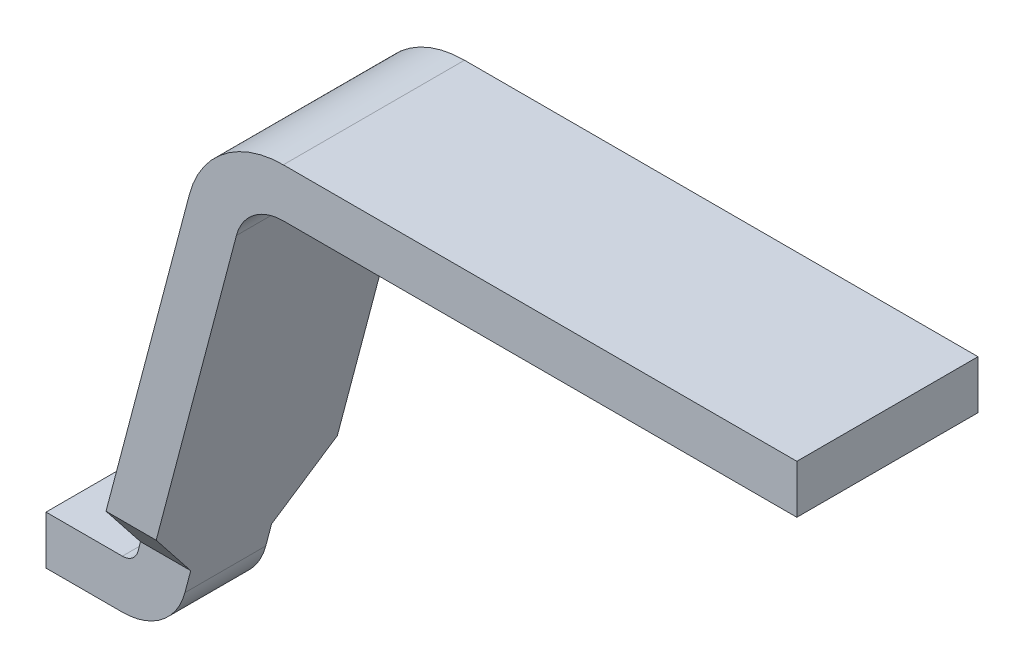
ISO-10303-21;
HEADER;
FILE_DESCRIPTION(('STEP AP214'),'2;1');
FILE_NAME('part.step','',(''),(''),'','','');
FILE_SCHEMA(('AUTOMOTIVE_DESIGN { 1 0 10303 214 1 1 1 1 }'));
ENDSEC;
DATA;
#1=APPLICATION_CONTEXT('core data for automotive mechanical design processes');
#2=APPLICATION_PROTOCOL_DEFINITION('international standard','automotive_design',2000,#1);
#3=PRODUCT_CONTEXT('',#1,'mechanical');
#4=PRODUCT('Part','Part','',(#3));
#5=PRODUCT_RELATED_PRODUCT_CATEGORY('part','',(#4));
#6=PRODUCT_DEFINITION_FORMATION('','',#4);
#7=PRODUCT_DEFINITION_CONTEXT('part definition',#1,'design');
#8=PRODUCT_DEFINITION('design','',#6,#7);
#9=PRODUCT_DEFINITION_SHAPE('','',#8);
#10=(LENGTH_UNIT() NAMED_UNIT(*) SI_UNIT(.MILLI.,.METRE.));
#11=(NAMED_UNIT(*) PLANE_ANGLE_UNIT() SI_UNIT($,.RADIAN.));
#12=(NAMED_UNIT(*) SI_UNIT($,.STERADIAN.) SOLID_ANGLE_UNIT());
#13=UNCERTAINTY_MEASURE_WITH_UNIT(LENGTH_MEASURE(1.E-05),#10,'distance_accuracy_value','');
#14=(GEOMETRIC_REPRESENTATION_CONTEXT(3) GLOBAL_UNCERTAINTY_ASSIGNED_CONTEXT((#13)) GLOBAL_UNIT_ASSIGNED_CONTEXT((#10,
#11,#12)) REPRESENTATION_CONTEXT('',''));
#15=CARTESIAN_POINT('',(0.,0.,0.));
#16=DIRECTION('',(0.,0.,1.));
#17=DIRECTION('',(1.,0.,0.));
#18=AXIS2_PLACEMENT_3D('',#15,#16,#17);
#19=CARTESIAN_POINT('',(-4.47992785115073,-3.05295006080988,1.12));
#20=DIRECTION('',(0.,1.,0.));
#21=DIRECTION('',(0.,0.,1.));
#22=AXIS2_PLACEMENT_3D('',#19,#20,#21);
#23=PLANE('',#22);
#24=DIRECTION('',(1.,0.,0.));
#25=VECTOR('',#24,1.);
#26=CARTESIAN_POINT('',(-4.95201474498883,-3.05295006080988,0.81));
#27=LINE('',#26,#25);
#28=CARTESIAN_POINT('',(-4.4799255523392,-3.05295006081318,0.81));
#29=VERTEX_POINT('',#28);
#30=CARTESIAN_POINT('',(-4.95201474498883,-3.05295006080988,0.81));
#31=VERTEX_POINT('',#30);
#32=EDGE_CURVE('E176',#29,#31,#27,.F.);
#33=ORIENTED_EDGE('',*,*,#32,.T.);
#34=DIRECTION('',(0.,0.,-1.));
#35=VECTOR('',#34,1.);
#36=CARTESIAN_POINT('',(-4.95201474498883,-3.05295006080988,1.12));
#37=LINE('',#36,#35);
#38=CARTESIAN_POINT('',(-4.95201474498883,-3.05295006080988,0.31));
#39=VERTEX_POINT('',#38);
#40=EDGE_CURVE('E169',#31,#39,#37,.T.);
#41=ORIENTED_EDGE('',*,*,#40,.T.);
#42=DIRECTION('',(1.,0.,0.));
#43=VECTOR('',#42,1.);
#44=CARTESIAN_POINT('',(-4.95201474498883,-3.05295006080988,0.31));
#45=LINE('',#44,#43);
#46=CARTESIAN_POINT('',(-4.4799255523392,-3.05295006081318,0.31));
#47=VERTEX_POINT('',#46);
#48=EDGE_CURVE('E185',#39,#47,#45,.T.);
#49=ORIENTED_EDGE('',*,*,#48,.T.);
#50=DIRECTION('',(0.,0.,-1.));
#51=VECTOR('',#50,1.);
#52=CARTESIAN_POINT('',(-4.4799255523392,-3.05295006081649,1.12));
#53=LINE('',#52,#51);
#54=EDGE_CURVE('E182',#29,#47,#53,.T.);
#55=ORIENTED_EDGE('',*,*,#54,.F.);
#56=EDGE_LOOP('',(#33,#41,#49,#55));
#57=FACE_BOUND('',#56,.T.);
#58=ADVANCED_FACE('F18',(#57),#23,.F.);
#59=CARTESIAN_POINT('',(-4.95201474498883,-2.75295117219364,1.12));
#60=DIRECTION('',(1.,0.,0.));
#61=DIRECTION('',(0.,0.,-1.));
#62=AXIS2_PLACEMENT_3D('',#59,#60,#61);
#63=PLANE('',#62);
#64=DIRECTION('',(0.,1.,0.));
#65=VECTOR('',#64,1.);
#66=CARTESIAN_POINT('',(-4.95201474498883,-2.61932913149392,0.81));
#67=LINE('',#66,#65);
#68=CARTESIAN_POINT('',(-4.95201474498883,-2.75295117219364,0.81));
#69=VERTEX_POINT('',#68);
#70=EDGE_CURVE('E172',#31,#69,#67,.T.);
#71=ORIENTED_EDGE('',*,*,#70,.T.);
#72=DIRECTION('',(0.,0.,1.));
#73=VECTOR('',#72,1.);
#74=CARTESIAN_POINT('',(-4.95201474498883,-2.75295117219364,1.12));
#75=LINE('',#74,#73);
#76=CARTESIAN_POINT('',(-4.95201474498883,-2.75295117219365,0.31));
#77=VERTEX_POINT('',#76);
#78=EDGE_CURVE('E167',#69,#77,#75,.F.);
#79=ORIENTED_EDGE('',*,*,#78,.T.);
#80=DIRECTION('',(0.,-1.,0.));
#81=VECTOR('',#80,1.);
#82=CARTESIAN_POINT('',(-4.95201474498883,-2.61932913149392,0.31));
#83=LINE('',#82,#81);
#84=EDGE_CURVE('E186',#77,#39,#83,.T.);
#85=ORIENTED_EDGE('',*,*,#84,.T.);
#86=ORIENTED_EDGE('',*,*,#40,.F.);
#87=EDGE_LOOP('',(#71,#79,#85,#86));
#88=FACE_BOUND('',#87,.T.);
#89=ADVANCED_FACE('F292',(#88),#63,.F.);
#90=CARTESIAN_POINT('',(-4.4799255523392,-2.75295117219365,1.12));
#91=DIRECTION('',(0.,-1.,0.));
#92=DIRECTION('',(1.,0.,0.));
#93=AXIS2_PLACEMENT_3D('',#90,#91,#92);
#94=PLANE('',#93);
#95=DIRECTION('',(1.,0.,0.));
#96=VECTOR('',#95,1.);
#97=CARTESIAN_POINT('',(-4.95201474498883,-2.75295117219364,0.81));
#98=LINE('',#97,#96);
#99=CARTESIAN_POINT('',(-4.4799255523392,-2.75295117219364,0.81));
#100=VERTEX_POINT('',#99);
#101=EDGE_CURVE('E175',#69,#100,#98,.T.);
#102=ORIENTED_EDGE('',*,*,#101,.T.);
#103=DIRECTION('',(0.,0.,-1.));
#104=VECTOR('',#103,1.);
#105=CARTESIAN_POINT('',(-4.4799255523392,-2.75295117219364,1.12));
#106=LINE('',#105,#104);
#107=CARTESIAN_POINT('',(-4.4799255523392,-2.75295117219365,0.31));
#108=VERTEX_POINT('',#107);
#109=EDGE_CURVE('E138',#100,#108,#106,.T.);
#110=ORIENTED_EDGE('',*,*,#109,.T.);
#111=DIRECTION('',(1.,0.,0.));
#112=VECTOR('',#111,1.);
#113=CARTESIAN_POINT('',(-4.95201474498883,-2.75295117219365,0.31));
#114=LINE('',#113,#112);
#115=EDGE_CURVE('E135',#108,#77,#114,.F.);
#116=ORIENTED_EDGE('',*,*,#115,.T.);
#117=ORIENTED_EDGE('',*,*,#78,.F.);
#118=EDGE_LOOP('',(#102,#110,#116,#117));
#119=FACE_BOUND('',#118,.T.);
#120=ADVANCED_FACE('F294',(#119),#94,.F.);
#121=CARTESIAN_POINT('',(-4.4799255523392,-2.65295117219366,1.12));
#122=DIRECTION('',(0.,0.,-1.));
#123=DIRECTION('',(-1.,0.,0.));
#124=AXIS2_PLACEMENT_3D('',#121,#122,#123);
#125=CYLINDRICAL_SURFACE('',#124,0.0999999999999786);
#126=CARTESIAN_POINT('',(-4.4799255523392,-2.65295117219366,0.81));
#127=DIRECTION('',(0.,0.,-1.));
#128=DIRECTION('',(-1.,0.,0.));
#129=AXIS2_PLACEMENT_3D('',#126,#127,#128);
#130=CIRCLE('',#129,0.0999999999999786);
#131=CARTESIAN_POINT('',(-4.38323405398539,-2.67846105549578,0.81));
#132=VERTEX_POINT('',#131);
#133=EDGE_CURVE('E151',#100,#132,#130,.F.);
#134=ORIENTED_EDGE('',*,*,#133,.T.);
#135=DIRECTION('',(0.,0.,1.));
#136=VECTOR('',#135,1.);
#137=CARTESIAN_POINT('',(-4.38323405398538,-2.67846105549574,1.12));
#138=LINE('',#137,#136);
#139=CARTESIAN_POINT('',(-4.38323405398539,-2.67846105549578,0.31));
#140=VERTEX_POINT('',#139);
#141=EDGE_CURVE('E143',#132,#140,#138,.F.);
#142=ORIENTED_EDGE('',*,*,#141,.T.);
#143=CARTESIAN_POINT('',(-4.4799255523392,-2.65295117219366,0.31));
#144=DIRECTION('',(0.,0.,-1.));
#145=DIRECTION('',(-1.,0.,0.));
#146=AXIS2_PLACEMENT_3D('',#143,#144,#145);
#147=CIRCLE('',#146,0.0999999999999786);
#148=EDGE_CURVE('E21',#140,#108,#147,.T.);
#149=ORIENTED_EDGE('',*,*,#148,.T.);
#150=ORIENTED_EDGE('',*,*,#109,.F.);
#151=EDGE_LOOP('',(#134,#142,#149,#150));
#152=FACE_BOUND('',#151,.T.);
#153=ADVANCED_FACE('F149',(#152),#125,.F.);
#154=CARTESIAN_POINT('',(-4.95201474498883,-2.61932913149392,0.31));
#155=DIRECTION('',(0.,0.,1.));
#156=DIRECTION('',(0.,-1.,0.));
#157=AXIS2_PLACEMENT_3D('',#154,#155,#156);
#158=PLANE('',#157);
#159=DIRECTION('',(-0.255098833021712,-0.966914983538346,0.));
#160=VECTOR('',#159,1.);
#161=CARTESIAN_POINT('',(-3.46485004867951,-0.373470633608013,0.309999999999999));
#162=LINE('',#161,#160);
#163=CARTESIAN_POINT('',(-4.05736944458963,-2.61932913149392,0.31));
#164=VERTEX_POINT('',#163);
#165=CARTESIAN_POINT('',(-4.09316070833002,-2.75499070540402,0.31));
#166=VERTEX_POINT('',#165);
#167=EDGE_CURVE('E223',#164,#166,#162,.T.);
#168=ORIENTED_EDGE('',*,*,#167,.T.);
#169=CARTESIAN_POINT('',(-4.4799255523392,-2.65295117219366,0.31));
#170=DIRECTION('',(0.,0.,-1.));
#171=DIRECTION('',(-1.,0.,0.));
#172=AXIS2_PLACEMENT_3D('',#169,#170,#171);
#173=CIRCLE('',#172,0.399998888622822);
#174=EDGE_CURVE('E184',#47,#166,#173,.F.);
#175=ORIENTED_EDGE('',*,*,#174,.F.);
#176=ORIENTED_EDGE('',*,*,#48,.F.);
#177=ORIENTED_EDGE('',*,*,#84,.F.);
#178=ORIENTED_EDGE('',*,*,#115,.F.);
#179=ORIENTED_EDGE('',*,*,#148,.F.);
#180=DIRECTION('',(0.255098833021717,0.966914983538345,0.));
#181=VECTOR('',#180,1.);
#182=CARTESIAN_POINT('',(-3.75492331953632,-0.296940700186821,0.31));
#183=LINE('',#182,#181);
#184=CARTESIAN_POINT('',(-4.36763342201255,-2.61932913149392,0.31));
#185=VERTEX_POINT('',#184);
#186=EDGE_CURVE('E131',#140,#185,#183,.T.);
#187=ORIENTED_EDGE('',*,*,#186,.T.);
#188=DIRECTION('',(1.,0.,0.));
#189=VECTOR('',#188,1.);
#190=CARTESIAN_POINT('',(-4.95201474498883,-2.61932913149392,0.31));
#191=LINE('',#190,#189);
#192=EDGE_CURVE('E228',#185,#164,#191,.T.);
#193=ORIENTED_EDGE('',*,*,#192,.T.);
#194=EDGE_LOOP('',(#168,#175,#176,#177,#178,#179,#187,#193));
#195=FACE_BOUND('',#194,.T.);
#196=ADVANCED_FACE('F130',(#195),#158,.F.);
#197=CARTESIAN_POINT('',(-4.4799255523392,-2.65295117219366,1.12));
#198=DIRECTION('',(0.,0.,-1.));
#199=DIRECTION('',(-1.,0.,0.));
#200=AXIS2_PLACEMENT_3D('',#197,#198,#199);
#201=CYLINDRICAL_SURFACE('',#200,0.399998888622822);
#202=ORIENTED_EDGE('',*,*,#54,.T.);
#203=ORIENTED_EDGE('',*,*,#174,.T.);
#204=DIRECTION('',(0.,0.,1.));
#205=VECTOR('',#204,1.);
#206=CARTESIAN_POINT('',(-4.09316078312852,-2.75499098891682,1.12));
#207=LINE('',#206,#205);
#208=CARTESIAN_POINT('',(-4.09316070833002,-2.75499070540402,0.81));
#209=VERTEX_POINT('',#208);
#210=EDGE_CURVE('E215',#166,#209,#207,.T.);
#211=ORIENTED_EDGE('',*,*,#210,.T.);
#212=CARTESIAN_POINT('',(-4.4799255523392,-2.65295117219366,0.81));
#213=DIRECTION('',(0.,0.,-1.));
#214=DIRECTION('',(-1.,0.,0.));
#215=AXIS2_PLACEMENT_3D('',#212,#213,#214);
#216=CIRCLE('',#215,0.399998888622822);
#217=EDGE_CURVE('E208',#209,#29,#216,.T.);
#218=ORIENTED_EDGE('',*,*,#217,.T.);
#219=EDGE_LOOP('',(#202,#203,#211,#218));
#220=FACE_BOUND('',#219,.T.);
#221=ADVANCED_FACE('F214',(#220),#201,.T.);
#222=CARTESIAN_POINT('',(-4.95201474498883,-2.61932913149392,0.81));
#223=DIRECTION('',(0.,0.,-1.));
#224=DIRECTION('',(0.,1.,0.));
#225=AXIS2_PLACEMENT_3D('',#222,#223,#224);
#226=PLANE('',#225);
#227=ORIENTED_EDGE('',*,*,#101,.F.);
#228=ORIENTED_EDGE('',*,*,#70,.F.);
#229=ORIENTED_EDGE('',*,*,#32,.F.);
#230=ORIENTED_EDGE('',*,*,#217,.F.);
#231=DIRECTION('',(-0.255098833021712,-0.966914983538346,0.));
#232=VECTOR('',#231,1.);
#233=CARTESIAN_POINT('',(-3.46485004867951,-0.373470633608013,0.81));
#234=LINE('',#233,#232);
#235=CARTESIAN_POINT('',(-4.05736944458963,-2.61932913149392,0.81));
#236=VERTEX_POINT('',#235);
#237=EDGE_CURVE('E226',#209,#236,#234,.F.);
#238=ORIENTED_EDGE('',*,*,#237,.T.);
#239=DIRECTION('',(1.,0.,0.));
#240=VECTOR('',#239,1.);
#241=CARTESIAN_POINT('',(-4.95201474498883,-2.61932913149392,0.81));
#242=LINE('',#241,#240);
#243=CARTESIAN_POINT('',(-4.36763342201255,-2.61932913149392,0.81));
#244=VERTEX_POINT('',#243);
#245=EDGE_CURVE('E155',#236,#244,#242,.F.);
#246=ORIENTED_EDGE('',*,*,#245,.T.);
#247=DIRECTION('',(0.255098833021717,0.966914983538345,0.));
#248=VECTOR('',#247,1.);
#249=CARTESIAN_POINT('',(-3.75492331953632,-0.296940700186821,0.81));
#250=LINE('',#249,#248);
#251=EDGE_CURVE('E160',#244,#132,#250,.F.);
#252=ORIENTED_EDGE('',*,*,#251,.T.);
#253=ORIENTED_EDGE('',*,*,#133,.F.);
#254=EDGE_LOOP('',(#227,#228,#229,#230,#238,#246,#252,#253));
#255=FACE_BOUND('',#254,.T.);
#256=ADVANCED_FACE('F290',(#255),#226,.F.);
#257=CARTESIAN_POINT('',(-4.95201474498883,-2.25295006080988,1.12));
#258=DIRECTION('',(0.,0.645926383382755,-0.763399703464754));
#259=DIRECTION('',(0.,0.763399703464754,0.645926383382755));
#260=AXIS2_PLACEMENT_3D('',#257,#258,#259);
#261=PLANE('',#260);
#262=DIRECTION('',(0.197441163125989,0.74837198090008,0.633211153808228));
#263=VECTOR('',#262,1.);
#264=CARTESIAN_POINT('',(-4.05736944458963,-2.61932913149392,0.81));
#265=LINE('',#264,#263);
#266=CARTESIAN_POINT('',(-3.96070854371802,-2.25295006080988,1.12));
#267=VERTEX_POINT('',#266);
#268=EDGE_CURVE('E261',#236,#267,#265,.T.);
#269=ORIENTED_EDGE('',*,*,#268,.T.);
#270=DIRECTION('',(1.,0.,0.));
#271=VECTOR('',#270,1.);
#272=CARTESIAN_POINT('',(-3.17477555361796,-2.25295006080988,1.12));
#273=LINE('',#272,#271);
#274=CARTESIAN_POINT('',(-4.27097252114093,-2.25295006080988,1.12));
#275=VERTEX_POINT('',#274);
#276=EDGE_CURVE('E260',#275,#267,#273,.T.);
#277=ORIENTED_EDGE('',*,*,#276,.F.);
#278=DIRECTION('',(-0.197441163125993,-0.748371980900079,-0.633211153808228));
#279=VECTOR('',#278,1.);
#280=CARTESIAN_POINT('',(-4.27097252114093,-2.25295006080988,1.12));
#281=LINE('',#280,#279);
#282=EDGE_CURVE('E162',#275,#244,#281,.T.);
#283=ORIENTED_EDGE('',*,*,#282,.T.);
#284=ORIENTED_EDGE('',*,*,#245,.F.);
#285=EDGE_LOOP('',(#269,#277,#283,#284));
#286=FACE_BOUND('',#285,.T.);
#287=ADVANCED_FACE('F299',(#286),#261,.F.);
#288=CARTESIAN_POINT('',(-3.17477325480426,0.149998605103842,1.12));
#289=DIRECTION('',(4.39368777594729E-07,-0.999999999999904,0.));
#290=DIRECTION('',(0.999999999999904,4.39368777594729E-07,0.));
#291=AXIS2_PLACEMENT_3D('',#288,#289,#290);
#292=PLANE('',#291);
#293=DIRECTION('',(0.,0.,-1.));
#294=VECTOR('',#293,1.);
#295=CARTESIAN_POINT('',(-3.17477325480426,0.149998605103842,1.12));
#296=LINE('',#295,#294);
#297=CARTESIAN_POINT('',(-3.17477440421111,0.14999930255197,1.12));
#298=VERTEX_POINT('',#297);
#299=CARTESIAN_POINT('',(-3.17477440421111,0.14999930255197,0.));
#300=VERTEX_POINT('',#299);
#301=EDGE_CURVE('E153',#298,#300,#296,.T.);
#302=ORIENTED_EDGE('',*,*,#301,.F.);
#303=DIRECTION('',(1.,0.,0.));
#304=VECTOR('',#303,1.);
#305=CARTESIAN_POINT('',(-3.17477555361796,0.150000000000098,1.12));
#306=LINE('',#305,#304);
#307=CARTESIAN_POINT('',(2.67906612692881E-08,0.150000000000098,1.12));
#308=VERTEX_POINT('',#307);
#309=EDGE_CURVE('E203',#308,#298,#306,.F.);
#310=ORIENTED_EDGE('',*,*,#309,.F.);
#311=DIRECTION('',(0.,0.,1.));
#312=VECTOR('',#311,1.);
#313=CARTESIAN_POINT('',(2.67906612692881E-08,0.150000000000098,1.12));
#314=LINE('',#313,#312);
#315=CARTESIAN_POINT('',(2.67906612692881E-08,0.150000000000098,0.));
#316=VERTEX_POINT('',#315);
#317=EDGE_CURVE('E199',#308,#316,#314,.F.);
#318=ORIENTED_EDGE('',*,*,#317,.T.);
#319=DIRECTION('',(1.,0.,0.));
#320=VECTOR('',#319,1.);
#321=CARTESIAN_POINT('',(-3.17477555361796,0.150000000000098,0.));
#322=LINE('',#321,#320);
#323=EDGE_CURVE('E195',#316,#300,#322,.F.);
#324=ORIENTED_EDGE('',*,*,#323,.T.);
#325=EDGE_LOOP('',(#302,#310,#318,#324));
#326=FACE_BOUND('',#325,.T.);
#327=ADVANCED_FACE('F368',(#326),#292,.F.);
#328=CARTESIAN_POINT('',(-3.17477555361796,-0.450000283514479,1.12));
#329=DIRECTION('',(0.,0.,-1.));
#330=DIRECTION('',(-1.,0.,0.));
#331=AXIS2_PLACEMENT_3D('',#328,#329,#330);
#332=CYLINDRICAL_SURFACE('',#331,0.599998888622724);
#333=CARTESIAN_POINT('',(-3.17477555361796,-0.450000283514479,1.12));
#334=DIRECTION('',(0.,0.,-1.));
#335=DIRECTION('',(-1.,0.,0.));
#336=AXIS2_PLACEMENT_3D('',#333,#334,#335);
#337=CIRCLE('',#336,0.599998888622724);
#338=CARTESIAN_POINT('',(-3.75492339433484,-0.296940983699695,1.12));
#339=VERTEX_POINT('',#338);
#340=EDGE_CURVE('E200',#298,#339,#337,.F.);
#341=ORIENTED_EDGE('',*,*,#340,.F.);
#342=ORIENTED_EDGE('',*,*,#301,.T.);
#343=CARTESIAN_POINT('',(-3.17477555361796,-0.450000283514479,0.));
#344=DIRECTION('',(0.,0.,-1.));
#345=DIRECTION('',(-1.,0.,0.));
#346=AXIS2_PLACEMENT_3D('',#343,#344,#345);
#347=CIRCLE('',#346,0.599998888622724);
#348=CARTESIAN_POINT('',(-3.75492339433484,-0.296940983699695,0.));
#349=VERTEX_POINT('',#348);
#350=EDGE_CURVE('E191',#300,#349,#347,.F.);
#351=ORIENTED_EDGE('',*,*,#350,.T.);
#352=DIRECTION('',(0.,0.,1.));
#353=VECTOR('',#352,1.);
#354=CARTESIAN_POINT('',(-3.75492331953632,-0.296940700186821,1.12));
#355=LINE('',#354,#353);
#356=EDGE_CURVE('E147',#349,#339,#355,.T.);
#357=ORIENTED_EDGE('',*,*,#356,.T.);
#358=EDGE_LOOP('',(#341,#342,#351,#357));
#359=FACE_BOUND('',#358,.T.);
#360=ADVANCED_FACE('F371',(#359),#332,.T.);
#361=CARTESIAN_POINT('',(-3.75492331953632,-0.296940700186821,1.12));
#362=DIRECTION('',(0.966914983538345,-0.255098833021717,0.));
#363=DIRECTION('',(0.255098833021717,0.966914983538345,0.));
#364=AXIS2_PLACEMENT_3D('',#361,#362,#363);
#365=PLANE('',#364);
#366=ORIENTED_EDGE('',*,*,#282,.F.);
#367=DIRECTION('',(-0.255098833021717,-0.966914983538345,0.));
#368=VECTOR('',#367,1.);
#369=CARTESIAN_POINT('',(-3.75492331953632,-0.296940700186821,1.12));
#370=LINE('',#369,#368);
#371=EDGE_CURVE('E202',#339,#275,#370,.T.);
#372=ORIENTED_EDGE('',*,*,#371,.F.);
#373=ORIENTED_EDGE('',*,*,#356,.F.);
#374=DIRECTION('',(-0.255098833021716,-0.966914983538345,0.));
#375=VECTOR('',#374,1.);
#376=CARTESIAN_POINT('',(-3.75492331953632,-0.296940700186821,0.));
#377=LINE('',#376,#375);
#378=CARTESIAN_POINT('',(-4.27097252114093,-2.25295006080988,0.));
#379=VERTEX_POINT('',#378);
#380=EDGE_CURVE('E194',#349,#379,#377,.T.);
#381=ORIENTED_EDGE('',*,*,#380,.T.);
#382=DIRECTION('',(-0.197441163125993,-0.748371980900079,0.633211153808228));
#383=VECTOR('',#382,1.);
#384=CARTESIAN_POINT('',(-4.27097252114093,-2.25295006080988,0.));
#385=LINE('',#384,#383);
#386=EDGE_CURVE('E146',#379,#185,#385,.T.);
#387=ORIENTED_EDGE('',*,*,#386,.T.);
#388=ORIENTED_EDGE('',*,*,#186,.F.);
#389=ORIENTED_EDGE('',*,*,#141,.F.);
#390=ORIENTED_EDGE('',*,*,#251,.F.);
#391=EDGE_LOOP('',(#366,#372,#373,#381,#387,#388,#389,#390));
#392=FACE_BOUND('',#391,.T.);
#393=ADVANCED_FACE('F141',(#392),#365,.F.);
#394=CARTESIAN_POINT('',(-4.95201474498883,-2.25295006080988,0.));
#395=DIRECTION('',(0.,0.645926383382755,0.763399703464754));
#396=DIRECTION('',(0.,-0.763399703464754,0.645926383382755));
#397=AXIS2_PLACEMENT_3D('',#394,#395,#396);
#398=PLANE('',#397);
#399=DIRECTION('',(-0.197441163125988,-0.74837198090008,0.633211153808228));
#400=VECTOR('',#399,1.);
#401=CARTESIAN_POINT('',(-3.96070854371802,-2.25295006080988,0.));
#402=LINE('',#401,#400);
#403=CARTESIAN_POINT('',(-3.96070854371802,-2.25295006080988,0.));
#404=VERTEX_POINT('',#403);
#405=EDGE_CURVE('E229',#404,#164,#402,.T.);
#406=ORIENTED_EDGE('',*,*,#405,.T.);
#407=ORIENTED_EDGE('',*,*,#192,.F.);
#408=ORIENTED_EDGE('',*,*,#386,.F.);
#409=DIRECTION('',(1.,0.,0.));
#410=VECTOR('',#409,1.);
#411=CARTESIAN_POINT('',(-3.17477555361796,-2.25295006080988,0.));
#412=LINE('',#411,#410);
#413=EDGE_CURVE('E320',#379,#404,#412,.T.);
#414=ORIENTED_EDGE('',*,*,#413,.T.);
#415=EDGE_LOOP('',(#406,#407,#408,#414));
#416=FACE_BOUND('',#415,.T.);
#417=ADVANCED_FACE('F379',(#416),#398,.F.);
#418=CARTESIAN_POINT('',(-3.46485004867951,-0.373470633608013,1.12));
#419=DIRECTION('',(-0.966914983538346,0.255098833021712,0.));
#420=DIRECTION('',(-0.255098833021712,-0.966914983538346,0.));
#421=AXIS2_PLACEMENT_3D('',#418,#419,#420);
#422=PLANE('',#421);
#423=ORIENTED_EDGE('',*,*,#268,.F.);
#424=ORIENTED_EDGE('',*,*,#237,.F.);
#425=ORIENTED_EDGE('',*,*,#210,.F.);
#426=ORIENTED_EDGE('',*,*,#167,.F.);
#427=ORIENTED_EDGE('',*,*,#405,.F.);
#428=DIRECTION('',(0.255098833021712,0.966914983538347,0.));
#429=VECTOR('',#428,1.);
#430=CARTESIAN_POINT('',(-3.96070854371802,-2.25295006080988,0.));
#431=LINE('',#430,#429);
#432=CARTESIAN_POINT('',(-3.4648500486795,-0.373470633607985,0.));
#433=VERTEX_POINT('',#432);
#434=EDGE_CURVE('E322',#404,#433,#431,.T.);
#435=ORIENTED_EDGE('',*,*,#434,.T.);
#436=DIRECTION('',(0.,0.,-1.));
#437=VECTOR('',#436,1.);
#438=CARTESIAN_POINT('',(-3.46485004867951,-0.373470633608013,1.12));
#439=LINE('',#438,#437);
#440=CARTESIAN_POINT('',(-3.4648500486795,-0.373470633607985,1.12));
#441=VERTEX_POINT('',#440);
#442=EDGE_CURVE('E257',#433,#441,#439,.F.);
#443=ORIENTED_EDGE('',*,*,#442,.T.);
#444=DIRECTION('',(0.255098833021711,0.966914983538347,0.));
#445=VECTOR('',#444,1.);
#446=CARTESIAN_POINT('',(-3.96070854371802,-2.25295006080988,1.12));
#447=LINE('',#446,#445);
#448=EDGE_CURVE('E206',#267,#441,#447,.T.);
#449=ORIENTED_EDGE('',*,*,#448,.F.);
#450=EDGE_LOOP('',(#423,#424,#425,#426,#427,#435,#443,#449));
#451=FACE_BOUND('',#450,.T.);
#452=ADVANCED_FACE('F222',(#451),#422,.F.);
#453=CARTESIAN_POINT('',(-3.17477555361796,-0.450000283514479,1.12));
#454=DIRECTION('',(0.,0.,-1.));
#455=DIRECTION('',(-1.,0.,0.));
#456=AXIS2_PLACEMENT_3D('',#453,#454,#455);
#457=CYLINDRICAL_SURFACE('',#456,0.300000000000031);
#458=DIRECTION('',(0.,0.,1.));
#459=VECTOR('',#458,1.);
#460=CARTESIAN_POINT('',(-3.17477555361797,-0.150000283514448,1.12));
#461=LINE('',#460,#459);
#462=CARTESIAN_POINT('',(-3.17477555361796,-0.150000283514448,0.));
#463=VERTEX_POINT('',#462);
#464=CARTESIAN_POINT('',(-3.17477555361796,-0.150000283514448,1.12));
#465=VERTEX_POINT('',#464);
#466=EDGE_CURVE('E326',#463,#465,#461,.T.);
#467=ORIENTED_EDGE('',*,*,#466,.T.);
#468=CARTESIAN_POINT('',(-3.17477555361796,-0.450000283514479,1.12));
#469=DIRECTION('',(0.,0.,-1.));
#470=DIRECTION('',(-1.,0.,0.));
#471=AXIS2_PLACEMENT_3D('',#468,#469,#470);
#472=CIRCLE('',#471,0.300000000000031);
#473=EDGE_CURVE('E204',#441,#465,#472,.T.);
#474=ORIENTED_EDGE('',*,*,#473,.F.);
#475=ORIENTED_EDGE('',*,*,#442,.F.);
#476=CARTESIAN_POINT('',(-3.17477555361796,-0.450000283514479,0.));
#477=DIRECTION('',(0.,0.,-1.));
#478=DIRECTION('',(-1.,0.,0.));
#479=AXIS2_PLACEMENT_3D('',#476,#477,#478);
#480=CIRCLE('',#479,0.300000000000031);
#481=EDGE_CURVE('E196',#433,#463,#480,.T.);
#482=ORIENTED_EDGE('',*,*,#481,.T.);
#483=EDGE_LOOP('',(#467,#474,#475,#482));
#484=FACE_BOUND('',#483,.T.);
#485=ADVANCED_FACE('F359',(#484),#457,.F.);
#486=CARTESIAN_POINT('',(-3.17477555361796,-0.450000283514479,1.12));
#487=DIRECTION('',(0.,0.,1.));
#488=DIRECTION('',(1.,0.,0.));
#489=AXIS2_PLACEMENT_3D('',#486,#487,#488);
#490=PLANE('',#489);
#491=ORIENTED_EDGE('',*,*,#340,.T.);
#492=ORIENTED_EDGE('',*,*,#371,.T.);
#493=ORIENTED_EDGE('',*,*,#276,.T.);
#494=ORIENTED_EDGE('',*,*,#448,.T.);
#495=ORIENTED_EDGE('',*,*,#473,.T.);
#496=DIRECTION('',(1.,0.,0.));
#497=VECTOR('',#496,1.);
#498=CARTESIAN_POINT('',(-3.17477555361797,-0.150000283514448,1.12));
#499=LINE('',#498,#497);
#500=CARTESIAN_POINT('',(2.67906612986113E-08,-0.150000283514448,1.12));
#501=VERTEX_POINT('',#500);
#502=EDGE_CURVE('E340',#465,#501,#499,.T.);
#503=ORIENTED_EDGE('',*,*,#502,.T.);
#504=DIRECTION('',(0.,-1.,0.));
#505=VECTOR('',#504,1.);
#506=CARTESIAN_POINT('',(2.67906613572577E-08,-0.150000283514448,1.12));
#507=LINE('',#506,#505);
#508=EDGE_CURVE('E254',#501,#308,#507,.F.);
#509=ORIENTED_EDGE('',*,*,#508,.T.);
#510=ORIENTED_EDGE('',*,*,#309,.T.);
#511=EDGE_LOOP('',(#491,#492,#493,#494,#495,#503,#509,#510));
#512=FACE_BOUND('',#511,.T.);
#513=ADVANCED_FACE('F302',(#512),#490,.T.);
#514=CARTESIAN_POINT('',(2.67906613572577E-08,-0.150000283514448,1.12));
#515=DIRECTION('',(-1.,0.,0.));
#516=DIRECTION('',(0.,-1.,0.));
#517=AXIS2_PLACEMENT_3D('',#514,#515,#516);
#518=PLANE('',#517);
#519=ORIENTED_EDGE('',*,*,#317,.F.);
#520=ORIENTED_EDGE('',*,*,#508,.F.);
#521=DIRECTION('',(0.,0.,1.));
#522=VECTOR('',#521,1.);
#523=CARTESIAN_POINT('',(2.67906612692881E-08,-0.150000283514448,1.12));
#524=LINE('',#523,#522);
#525=CARTESIAN_POINT('',(2.67906612692881E-08,-0.150000283514448,0.));
#526=VERTEX_POINT('',#525);
#527=EDGE_CURVE('E27',#501,#526,#524,.F.);
#528=ORIENTED_EDGE('',*,*,#527,.T.);
#529=DIRECTION('',(0.,1.,0.));
#530=VECTOR('',#529,1.);
#531=CARTESIAN_POINT('',(2.67906612692881E-08,-0.450000283514479,0.));
#532=LINE('',#531,#530);
#533=EDGE_CURVE('E35',#526,#316,#532,.T.);
#534=ORIENTED_EDGE('',*,*,#533,.T.);
#535=EDGE_LOOP('',(#519,#520,#528,#534));
#536=FACE_BOUND('',#535,.T.);
#537=ADVANCED_FACE('F365',(#536),#518,.F.);
#538=CARTESIAN_POINT('',(-3.17477555361796,-0.450000283514479,0.));
#539=DIRECTION('',(0.,0.,1.));
#540=DIRECTION('',(1.,0.,0.));
#541=AXIS2_PLACEMENT_3D('',#538,#539,#540);
#542=PLANE('',#541);
#543=ORIENTED_EDGE('',*,*,#413,.F.);
#544=ORIENTED_EDGE('',*,*,#380,.F.);
#545=ORIENTED_EDGE('',*,*,#350,.F.);
#546=ORIENTED_EDGE('',*,*,#323,.F.);
#547=ORIENTED_EDGE('',*,*,#533,.F.);
#548=DIRECTION('',(1.,0.,0.));
#549=VECTOR('',#548,1.);
#550=CARTESIAN_POINT('',(-3.17477555361797,-0.150000283514448,0.));
#551=LINE('',#550,#549);
#552=EDGE_CURVE('E11',#526,#463,#551,.F.);
#553=ORIENTED_EDGE('',*,*,#552,.T.);
#554=ORIENTED_EDGE('',*,*,#481,.F.);
#555=ORIENTED_EDGE('',*,*,#434,.F.);
#556=EDGE_LOOP('',(#543,#544,#545,#546,#547,#553,#554,#555));
#557=FACE_BOUND('',#556,.T.);
#558=ADVANCED_FACE('F362',(#557),#542,.F.);
#559=CARTESIAN_POINT('',(-3.17477555361797,-0.150000283514448,1.12));
#560=DIRECTION('',(0.,1.,0.));
#561=DIRECTION('',(0.,0.,1.));
#562=AXIS2_PLACEMENT_3D('',#559,#560,#561);
#563=PLANE('',#562);
#564=ORIENTED_EDGE('',*,*,#527,.F.);
#565=ORIENTED_EDGE('',*,*,#502,.F.);
#566=ORIENTED_EDGE('',*,*,#466,.F.);
#567=ORIENTED_EDGE('',*,*,#552,.F.);
#568=EDGE_LOOP('',(#564,#565,#566,#567));
#569=FACE_BOUND('',#568,.T.);
#570=ADVANCED_FACE('F357',(#569),#563,.F.);
#571=CLOSED_SHELL('',(#58,#89,#120,#153,#196,#221,#256,#287,#327,#360,#393,#417,#452,#485,#513,
#537,#558,#570));
#572=MANIFOLD_SOLID_BREP('B1',#571);
#573=ADVANCED_BREP_SHAPE_REPRESENTATION('',(#18,#572),#14);
#574=SHAPE_DEFINITION_REPRESENTATION(#9,#573);
ENDSEC;
END-ISO-10303-21;
